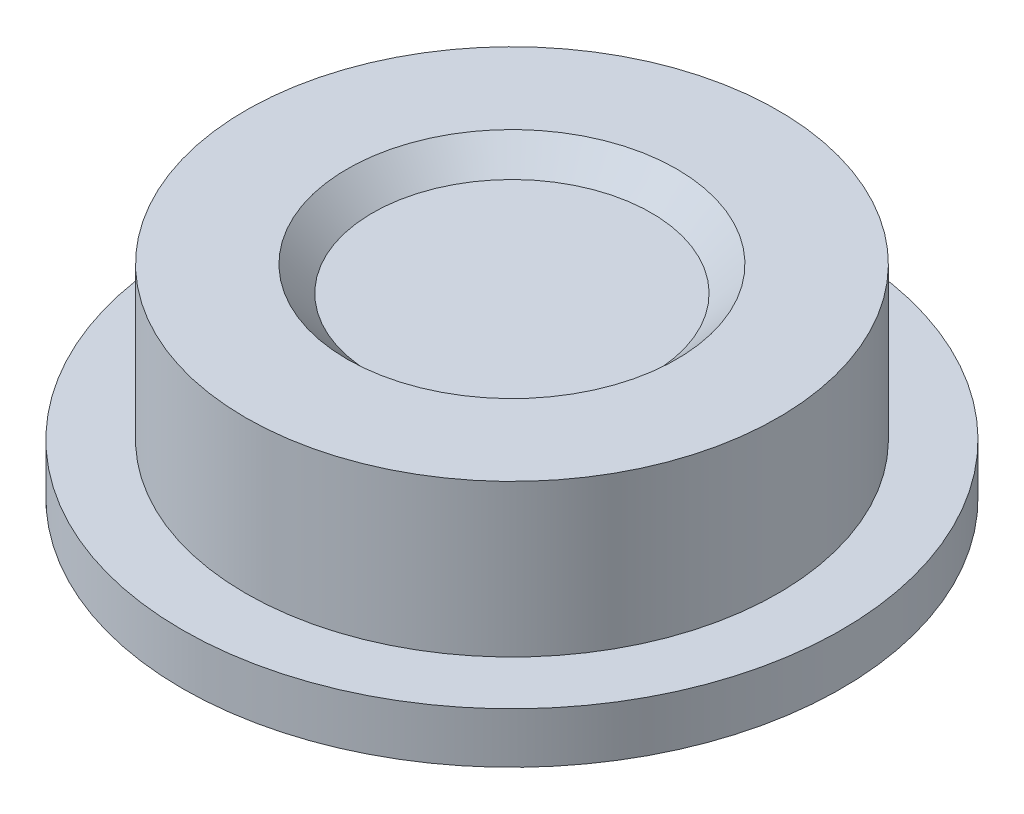
ISO-10303-21;
HEADER;
FILE_DESCRIPTION(('STEP AP214'),'2;1');
FILE_NAME('part.step','',(''),(''),'','','');
FILE_SCHEMA(('AUTOMOTIVE_DESIGN { 1 0 10303 214 1 1 1 1 }'));
ENDSEC;
DATA;
#1=APPLICATION_CONTEXT('core data for automotive mechanical design processes');
#2=APPLICATION_PROTOCOL_DEFINITION('international standard','automotive_design',2000,#1);
#3=PRODUCT_CONTEXT('',#1,'mechanical');
#4=PRODUCT('Part','Part','',(#3));
#5=PRODUCT_RELATED_PRODUCT_CATEGORY('part','',(#4));
#6=PRODUCT_DEFINITION_FORMATION('','',#4);
#7=PRODUCT_DEFINITION_CONTEXT('part definition',#1,'design');
#8=PRODUCT_DEFINITION('design','',#6,#7);
#9=PRODUCT_DEFINITION_SHAPE('','',#8);
#10=(LENGTH_UNIT() NAMED_UNIT(*) SI_UNIT(.MILLI.,.METRE.));
#11=(NAMED_UNIT(*) PLANE_ANGLE_UNIT() SI_UNIT($,.RADIAN.));
#12=(NAMED_UNIT(*) SI_UNIT($,.STERADIAN.) SOLID_ANGLE_UNIT());
#13=UNCERTAINTY_MEASURE_WITH_UNIT(LENGTH_MEASURE(1.E-05),#10,'distance_accuracy_value','');
#14=(GEOMETRIC_REPRESENTATION_CONTEXT(3) GLOBAL_UNCERTAINTY_ASSIGNED_CONTEXT((#13)) GLOBAL_UNIT_ASSIGNED_CONTEXT((#10,
#11,#12)) REPRESENTATION_CONTEXT('',''));
#15=CARTESIAN_POINT('',(0.,0.,0.));
#16=DIRECTION('',(0.,0.,1.));
#17=DIRECTION('',(1.,0.,0.));
#18=AXIS2_PLACEMENT_3D('',#15,#16,#17);
#19=CARTESIAN_POINT('',(0.,-1.,0.));
#20=DIRECTION('',(0.,1.,0.));
#21=DIRECTION('',(0.,0.,1.));
#22=AXIS2_PLACEMENT_3D('',#19,#20,#21);
#23=CYLINDRICAL_SURFACE('',#22,6.5);
#24=CARTESIAN_POINT('',(0.,-1.,0.));
#25=DIRECTION('',(0.,1.,0.));
#26=DIRECTION('',(0.,0.,1.));
#27=AXIS2_PLACEMENT_3D('',#24,#25,#26);
#28=CIRCLE('',#27,6.5);
#29=CARTESIAN_POINT('',(0.,-1.,6.5));
#30=VERTEX_POINT('',#29);
#31=EDGE_CURVE('E42',#30,#30,#28,.T.);
#32=ORIENTED_EDGE('',*,*,#31,.T.);
#33=EDGE_LOOP('',(#32));
#34=FACE_BOUND('',#33,.T.);
#35=CARTESIAN_POINT('',(0.,0.,0.));
#36=DIRECTION('',(0.,1.,0.));
#37=DIRECTION('',(0.,0.,1.));
#38=AXIS2_PLACEMENT_3D('',#35,#36,#37);
#39=CIRCLE('',#38,6.5);
#40=CARTESIAN_POINT('',(0.,0.,6.5));
#41=VERTEX_POINT('',#40);
#42=EDGE_CURVE('E47',#41,#41,#39,.T.);
#43=ORIENTED_EDGE('',*,*,#42,.F.);
#44=EDGE_LOOP('',(#43));
#45=FACE_BOUND('',#44,.T.);
#46=ADVANCED_FACE('F31',(#34,#45),#23,.T.);
#47=CARTESIAN_POINT('',(0.,-1.,0.));
#48=DIRECTION('',(0.,1.,0.));
#49=DIRECTION('',(0.,0.,1.));
#50=AXIS2_PLACEMENT_3D('',#47,#48,#49);
#51=PLANE('',#50);
#52=CARTESIAN_POINT('',(0.,-1.,0.));
#53=DIRECTION('',(0.,-1.,0.));
#54=DIRECTION('',(0.,0.,-1.));
#55=AXIS2_PLACEMENT_3D('',#52,#53,#54);
#56=CIRCLE('',#55,1.5);
#57=CARTESIAN_POINT('',(0.,-1.,-1.5));
#58=VERTEX_POINT('',#57);
#59=EDGE_CURVE('E64',#58,#58,#56,.T.);
#60=ORIENTED_EDGE('',*,*,#59,.F.);
#61=EDGE_LOOP('',(#60));
#62=FACE_BOUND('',#61,.T.);
#63=ORIENTED_EDGE('',*,*,#31,.F.);
#64=EDGE_LOOP('',(#63));
#65=FACE_BOUND('',#64,.T.);
#66=ADVANCED_FACE('F72',(#62,#65),#51,.F.);
#67=CARTESIAN_POINT('',(0.,0.,0.));
#68=DIRECTION('',(0.,1.,0.));
#69=DIRECTION('',(0.,0.,1.));
#70=AXIS2_PLACEMENT_3D('',#67,#68,#69);
#71=PLANE('',#70);
#72=CARTESIAN_POINT('',(0.,0.,0.));
#73=DIRECTION('',(0.,1.,0.));
#74=DIRECTION('',(0.,0.,1.));
#75=AXIS2_PLACEMENT_3D('',#72,#73,#74);
#76=CIRCLE('',#75,5.25);
#77=CARTESIAN_POINT('',(0.,0.,5.25));
#78=VERTEX_POINT('',#77);
#79=EDGE_CURVE('E38',#78,#78,#76,.T.);
#80=ORIENTED_EDGE('',*,*,#79,.F.);
#81=EDGE_LOOP('',(#80));
#82=FACE_BOUND('',#81,.T.);
#83=ORIENTED_EDGE('',*,*,#42,.T.);
#84=EDGE_LOOP('',(#83));
#85=FACE_BOUND('',#84,.T.);
#86=ADVANCED_FACE('F75',(#82,#85),#71,.T.);
#87=CARTESIAN_POINT('',(0.,3.,0.));
#88=DIRECTION('',(0.,-1.,0.));
#89=DIRECTION('',(0.,0.,-1.));
#90=AXIS2_PLACEMENT_3D('',#87,#88,#89);
#91=CYLINDRICAL_SURFACE('',#90,5.25);
#92=CARTESIAN_POINT('',(0.,3.,0.));
#93=DIRECTION('',(0.,1.,0.));
#94=DIRECTION('',(0.,0.,1.));
#95=AXIS2_PLACEMENT_3D('',#92,#93,#94);
#96=CIRCLE('',#95,5.25);
#97=CARTESIAN_POINT('',(0.,3.,5.25));
#98=VERTEX_POINT('',#97);
#99=EDGE_CURVE('E50',#98,#98,#96,.T.);
#100=ORIENTED_EDGE('',*,*,#99,.F.);
#101=EDGE_LOOP('',(#100));
#102=FACE_BOUND('',#101,.T.);
#103=ORIENTED_EDGE('',*,*,#79,.T.);
#104=EDGE_LOOP('',(#103));
#105=FACE_BOUND('',#104,.T.);
#106=ADVANCED_FACE('F85',(#102,#105),#91,.T.);
#107=CARTESIAN_POINT('',(0.,3.,0.));
#108=DIRECTION('',(0.,1.,0.));
#109=DIRECTION('',(0.,0.,1.));
#110=AXIS2_PLACEMENT_3D('',#107,#108,#109);
#111=PLANE('',#110);
#112=CARTESIAN_POINT('',(0.,3.,0.));
#113=DIRECTION('',(0.,1.,0.));
#114=DIRECTION('',(0.,0.,1.));
#115=AXIS2_PLACEMENT_3D('',#112,#113,#114);
#116=CIRCLE('',#115,3.25);
#117=CARTESIAN_POINT('',(0.,3.,3.25));
#118=VERTEX_POINT('',#117);
#119=EDGE_CURVE('E56',#118,#118,#116,.T.);
#120=ORIENTED_EDGE('',*,*,#119,.F.);
#121=EDGE_LOOP('',(#120));
#122=FACE_BOUND('',#121,.T.);
#123=ORIENTED_EDGE('',*,*,#99,.T.);
#124=EDGE_LOOP('',(#123));
#125=FACE_BOUND('',#124,.T.);
#126=ADVANCED_FACE('F90',(#122,#125),#111,.T.);
#127=CARTESIAN_POINT('',(0.,2.5,0.));
#128=DIRECTION('',(0.,1.,0.));
#129=DIRECTION('',(0.,0.,1.));
#130=AXIS2_PLACEMENT_3D('',#127,#128,#129);
#131=PLANE('',#130);
#132=CARTESIAN_POINT('',(0.,2.5,0.));
#133=DIRECTION('',(0.,1.,0.));
#134=DIRECTION('',(0.,0.,1.));
#135=AXIS2_PLACEMENT_3D('',#132,#133,#134);
#136=CIRCLE('',#135,2.75);
#137=CARTESIAN_POINT('',(0.,2.5,2.75));
#138=VERTEX_POINT('',#137);
#139=EDGE_CURVE('E10',#138,#138,#136,.T.);
#140=ORIENTED_EDGE('',*,*,#139,.T.);
#141=EDGE_LOOP('',(#140));
#142=FACE_BOUND('',#141,.T.);
#143=ADVANCED_FACE('F94',(#142),#131,.T.);
#144=CARTESIAN_POINT('',(0.,2.5,0.));
#145=DIRECTION('',(0.,1.,0.));
#146=DIRECTION('',(0.,0.,1.));
#147=AXIS2_PLACEMENT_3D('',#144,#145,#146);
#148=CONICAL_SURFACE('',#147,2.75,0.785398163397452);
#149=ORIENTED_EDGE('',*,*,#119,.T.);
#150=EDGE_LOOP('',(#149));
#151=FACE_BOUND('',#150,.T.);
#152=ORIENTED_EDGE('',*,*,#139,.F.);
#153=EDGE_LOOP('',(#152));
#154=FACE_BOUND('',#153,.T.);
#155=ADVANCED_FACE('F33',(#151,#154),#148,.F.);
#156=CARTESIAN_POINT('',(0.,-1.,0.));
#157=DIRECTION('',(0.,-1.,0.));
#158=DIRECTION('',(0.,0.,-1.));
#159=AXIS2_PLACEMENT_3D('',#156,#157,#158);
#160=CONICAL_SURFACE('',#159,1.5,0.698131700797733);
#161=CARTESIAN_POINT('',(0.,0.5,0.));
#162=DIRECTION('',(0.,-1.,0.));
#163=DIRECTION('',(0.,0.,-1.));
#164=AXIS2_PLACEMENT_3D('',#161,#162,#163);
#165=CIRCLE('',#164,0.241350553234076);
#166=CARTESIAN_POINT('',(0.,0.5,-0.241350553234076));
#167=VERTEX_POINT('',#166);
#168=EDGE_CURVE('E60',#167,#167,#165,.T.);
#169=CARTESIAN_POINT('',(0.,0.5,-0.241350553234076));
#170=CARTESIAN_POINT('',(0.,0.484375,-0.254461484971221));
#171=CARTESIAN_POINT('',(0.,0.46875,-0.267572416708366));
#172=CARTESIAN_POINT('',(0.,0.4375,-0.293794280182657));
#173=CARTESIAN_POINT('',(0.,0.421875,-0.306905211919802));
#174=CARTESIAN_POINT('',(0.,0.390625,-0.333127075394092));
#175=CARTESIAN_POINT('',(0.,0.375,-0.346238007131237));
#176=CARTESIAN_POINT('',(0.,0.34375,-0.372459870605527));
#177=CARTESIAN_POINT('',(0.,0.328125,-0.385570802342672));
#178=CARTESIAN_POINT('',(0.,0.296875,-0.411792665816962));
#179=CARTESIAN_POINT('',(0.,0.28125,-0.424903597554107));
#180=CARTESIAN_POINT('',(0.,0.25,-0.451125461028397));
#181=CARTESIAN_POINT('',(0.,0.234375,-0.464236392765542));
#182=CARTESIAN_POINT('',(0.,0.203125,-0.490458256239832));
#183=CARTESIAN_POINT('',(0.,0.1875,-0.503569187976977));
#184=CARTESIAN_POINT('',(0.,0.15625,-0.529791051451267));
#185=CARTESIAN_POINT('',(0.,0.140625,-0.542901983188412));
#186=CARTESIAN_POINT('',(0.,0.109375,-0.569123846662702));
#187=CARTESIAN_POINT('',(0.,0.0937500000000001,-0.582234778399847));
#188=CARTESIAN_POINT('',(0.,0.0625000000000001,-0.608456641874138));
#189=CARTESIAN_POINT('',(0.,0.0468750000000001,-0.621567573611282));
#190=CARTESIAN_POINT('',(0.,0.015625,-0.647789437085573));
#191=CARTESIAN_POINT('',(0.,0.,-0.660900368822718));
#192=CARTESIAN_POINT('',(0.,-0.03125,-0.687122232297008));
#193=CARTESIAN_POINT('',(0.,-0.046875,-0.700233164034153));
#194=CARTESIAN_POINT('',(0.,-0.078125,-0.726455027508443));
#195=CARTESIAN_POINT('',(0.,-0.09375,-0.739565959245588));
#196=CARTESIAN_POINT('',(0.,-0.125,-0.765787822719878));
#197=CARTESIAN_POINT('',(0.,-0.140625,-0.778898754457023));
#198=CARTESIAN_POINT('',(0.,-0.171875,-0.805120617931313));
#199=CARTESIAN_POINT('',(0.,-0.1875,-0.818231549668458));
#200=CARTESIAN_POINT('',(0.,-0.21875,-0.844453413142748));
#201=CARTESIAN_POINT('',(0.,-0.234375,-0.857564344879893));
#202=CARTESIAN_POINT('',(0.,-0.265625,-0.883786208354183));
#203=CARTESIAN_POINT('',(0.,-0.28125,-0.896897140091328));
#204=CARTESIAN_POINT('',(0.,-0.3125,-0.923119003565618));
#205=CARTESIAN_POINT('',(0.,-0.328125,-0.936229935302764));
#206=CARTESIAN_POINT('',(0.,-0.359375,-0.962451798777054));
#207=CARTESIAN_POINT('',(0.,-0.375,-0.975562730514199));
#208=CARTESIAN_POINT('',(0.,-0.40625,-1.00178459398849));
#209=CARTESIAN_POINT('',(0.,-0.421875,-1.01489552572563));
#210=CARTESIAN_POINT('',(0.,-0.453125,-1.04111738919992));
#211=CARTESIAN_POINT('',(0.,-0.46875,-1.05422832093707));
#212=CARTESIAN_POINT('',(0.,-0.5,-1.08045018441136));
#213=CARTESIAN_POINT('',(0.,-0.515625,-1.0935611161485));
#214=CARTESIAN_POINT('',(0.,-0.546875,-1.11978297962279));
#215=CARTESIAN_POINT('',(0.,-0.5625,-1.13289391135994));
#216=CARTESIAN_POINT('',(0.,-0.59375,-1.15911577483423));
#217=CARTESIAN_POINT('',(0.,-0.609375,-1.17222670657137));
#218=CARTESIAN_POINT('',(0.,-0.640625,-1.19844857004566));
#219=CARTESIAN_POINT('',(0.,-0.65625,-1.21155950178281));
#220=CARTESIAN_POINT('',(0.,-0.6875,-1.2377813652571));
#221=CARTESIAN_POINT('',(0.,-0.703125,-1.25089229699424));
#222=CARTESIAN_POINT('',(0.,-0.734375,-1.27711416046853));
#223=CARTESIAN_POINT('',(0.,-0.75,-1.29022509220568));
#224=CARTESIAN_POINT('',(0.,-0.78125,-1.31644695567997));
#225=CARTESIAN_POINT('',(0.,-0.796875,-1.32955788741711));
#226=CARTESIAN_POINT('',(0.,-0.828125,-1.3557797508914));
#227=CARTESIAN_POINT('',(0.,-0.84375,-1.36889068262855));
#228=CARTESIAN_POINT('',(0.,-0.875,-1.39511254610284));
#229=CARTESIAN_POINT('',(0.,-0.890625,-1.40822347783998));
#230=CARTESIAN_POINT('',(0.,-0.921875,-1.43444534131428));
#231=CARTESIAN_POINT('',(0.,-0.9375,-1.44755627305142));
#232=CARTESIAN_POINT('',(0.,-0.96875,-1.47377813652571));
#233=CARTESIAN_POINT('',(0.,-0.984375,-1.48688906826286));
#234=CARTESIAN_POINT('',(0.,-1.,-1.5));
#235=B_SPLINE_CURVE_WITH_KNOTS('',3,(#169,#170,#171,#172,#173,#174,#175,#176,#177,#178,#179,
#180,#181,#182,#183,#184,#185,#186,#187,#188,#189,#190,#191,#192,#193,#194,#195,#196,#197,#198,
#199,#200,#201,#202,#203,#204,#205,#206,#207,#208,#209,#210,#211,#212,#213,#214,#215,#216,#217,
#218,#219,#220,#221,#222,#223,#224,#225,#226,#227,#228,#229,#230,#231,#232,#233,#234),
.UNSPECIFIED.,.F.,.F.,(4,2,2,2,2,2,2,2,2,2,2,2,2,2,2,2,2,2,2,2,2,2,2,2,2,2,2,2,2,2,2,2,4),(0.,
0.0611909666874507,0.122381933374901,0.183572900062352,0.244763866749803,0.305954833437253,
0.367145800124704,0.428336766812155,0.489527733499605,0.550718700187056,0.611909666874506,
0.673100633561957,0.734291600249408,0.795482566936858,0.856673533624309,0.917864500311759,
0.97905546699921,1.04024643368666,1.10143740037411,1.16262836706156,1.22381933374901,
1.28501030043646,1.34620126712391,1.40739223381136,1.46858320049882,1.52977416718627,
1.59096513387372,1.65215610056117,1.71334706724862,1.77453803393607,1.83572900062352,
1.89691996731097,1.95811093399842),.UNSPECIFIED.);
#236=EDGE_CURVE('BSEAM70',#167,#58,#235,.T.);
#237=ORIENTED_EDGE('',*,*,#168,.F.);
#238=ORIENTED_EDGE('',*,*,#59,.T.);
#239=ORIENTED_EDGE('',*,*,#236,.T.);
#240=ORIENTED_EDGE('',*,*,#236,.F.);
#241=EDGE_LOOP('',(#237,#239,#238,#240));
#242=FACE_BOUND('',#241,.T.);
#243=ADVANCED_FACE('F70',(#242),#160,.F.);
#244=CARTESIAN_POINT('',(0.,0.5,0.));
#245=DIRECTION('',(0.,-1.,0.));
#246=DIRECTION('',(0.,0.,-1.));
#247=AXIS2_PLACEMENT_3D('',#244,#245,#246);
#248=PLANE('',#247);
#249=ORIENTED_EDGE('',*,*,#168,.T.);
#250=EDGE_LOOP('',(#249));
#251=FACE_BOUND('',#250,.T.);
#252=ADVANCED_FACE('F100',(#251),#248,.T.);
#253=CLOSED_SHELL('',(#46,#66,#86,#106,#126,#143,#155,#243,#252));
#254=MANIFOLD_SOLID_BREP('B2',#253);
#255=ADVANCED_BREP_SHAPE_REPRESENTATION('',(#18,#254),#14);
#256=SHAPE_DEFINITION_REPRESENTATION(#9,#255);
ENDSEC;
END-ISO-10303-21;
